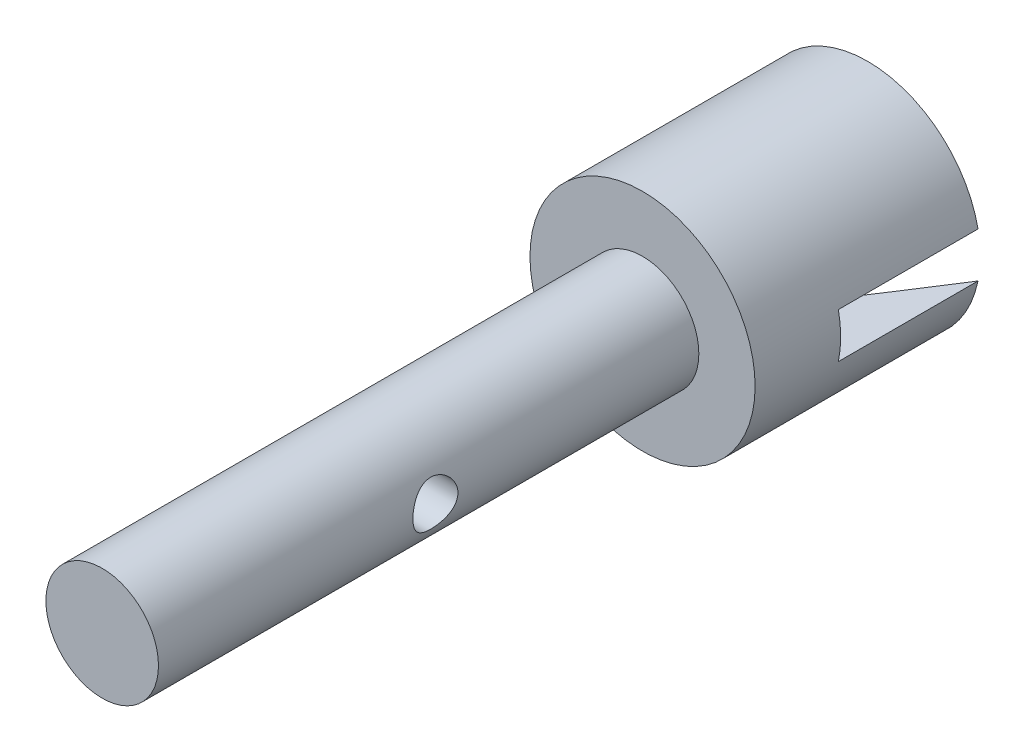
ISO-10303-21;
HEADER;
FILE_DESCRIPTION(('STEP AP214'),'2;1');
FILE_NAME('part.step','',(''),(''),'','','');
FILE_SCHEMA(('AUTOMOTIVE_DESIGN { 1 0 10303 214 1 1 1 1 }'));
ENDSEC;
DATA;
#1=APPLICATION_CONTEXT('core data for automotive mechanical design processes');
#2=APPLICATION_PROTOCOL_DEFINITION('international standard','automotive_design',2000,#1);
#3=PRODUCT_CONTEXT('',#1,'mechanical');
#4=PRODUCT('Part','Part','',(#3));
#5=PRODUCT_RELATED_PRODUCT_CATEGORY('part','',(#4));
#6=PRODUCT_DEFINITION_FORMATION('','',#4);
#7=PRODUCT_DEFINITION_CONTEXT('part definition',#1,'design');
#8=PRODUCT_DEFINITION('design','',#6,#7);
#9=PRODUCT_DEFINITION_SHAPE('','',#8);
#10=(LENGTH_UNIT() NAMED_UNIT(*) SI_UNIT(.MILLI.,.METRE.));
#11=(NAMED_UNIT(*) PLANE_ANGLE_UNIT() SI_UNIT($,.RADIAN.));
#12=(NAMED_UNIT(*) SI_UNIT($,.STERADIAN.) SOLID_ANGLE_UNIT());
#13=UNCERTAINTY_MEASURE_WITH_UNIT(LENGTH_MEASURE(1.E-05),#10,'distance_accuracy_value','');
#14=(GEOMETRIC_REPRESENTATION_CONTEXT(3) GLOBAL_UNCERTAINTY_ASSIGNED_CONTEXT((#13)) GLOBAL_UNIT_ASSIGNED_CONTEXT((#10,
#11,#12)) REPRESENTATION_CONTEXT('',''));
#15=CARTESIAN_POINT('',(0.,0.,0.));
#16=DIRECTION('',(0.,0.,1.));
#17=DIRECTION('',(1.,0.,0.));
#18=AXIS2_PLACEMENT_3D('',#15,#16,#17);
#19=CARTESIAN_POINT('',(0.,0.,10.));
#20=DIRECTION('',(0.,0.,-1.));
#21=DIRECTION('',(-1.,0.,0.));
#22=AXIS2_PLACEMENT_3D('',#19,#20,#21);
#23=CYLINDRICAL_SURFACE('',#22,5.);
#24=CARTESIAN_POINT('',(0.,0.,10.));
#25=DIRECTION('',(0.,0.,1.));
#26=DIRECTION('',(1.,0.,0.));
#27=AXIS2_PLACEMENT_3D('',#24,#25,#26);
#28=CIRCLE('',#27,5.);
#29=CARTESIAN_POINT('',(5.,0.,10.));
#30=VERTEX_POINT('',#29);
#31=EDGE_CURVE('E216',#30,#30,#28,.T.);
#32=ORIENTED_EDGE('',*,*,#31,.F.);
#33=EDGE_LOOP('',(#32));
#34=FACE_BOUND('',#33,.T.);
#35=DIRECTION('',(0.,0.,-1.));
#36=VECTOR('',#35,1.);
#37=CARTESIAN_POINT('',(-4.89897948556636,-1.,10.));
#38=LINE('',#37,#36);
#39=CARTESIAN_POINT('',(-4.89897948556636,-1.,0.));
#40=VERTEX_POINT('',#39);
#41=CARTESIAN_POINT('',(-4.89897948556636,-1.,6.2));
#42=VERTEX_POINT('',#41);
#43=EDGE_CURVE('E133',#40,#42,#38,.F.);
#44=ORIENTED_EDGE('',*,*,#43,.F.);
#45=CARTESIAN_POINT('',(0.,0.,0.));
#46=DIRECTION('',(0.,0.,1.));
#47=DIRECTION('',(1.,0.,0.));
#48=AXIS2_PLACEMENT_3D('',#45,#46,#47);
#49=CIRCLE('',#48,5.);
#50=CARTESIAN_POINT('',(4.89897948556636,-0.999999999999999,0.));
#51=VERTEX_POINT('',#50);
#52=EDGE_CURVE('E211',#40,#51,#49,.T.);
#53=ORIENTED_EDGE('',*,*,#52,.T.);
#54=DIRECTION('',(0.,0.,-1.));
#55=VECTOR('',#54,1.);
#56=CARTESIAN_POINT('',(4.89897948556636,-0.999999999999999,10.));
#57=LINE('',#56,#55);
#58=CARTESIAN_POINT('',(4.89897948556636,-0.999999999999999,6.2));
#59=VERTEX_POINT('',#58);
#60=EDGE_CURVE('E143',#59,#51,#57,.T.);
#61=ORIENTED_EDGE('',*,*,#60,.F.);
#62=CARTESIAN_POINT('',(0.,0.,6.2));
#63=DIRECTION('',(0.,0.,1.));
#64=DIRECTION('',(1.,0.,0.));
#65=AXIS2_PLACEMENT_3D('',#62,#63,#64);
#66=CIRCLE('',#65,5.);
#67=CARTESIAN_POINT('',(4.89897948556636,1.,6.2));
#68=VERTEX_POINT('',#67);
#69=EDGE_CURVE('E155',#59,#68,#66,.T.);
#70=ORIENTED_EDGE('',*,*,#69,.T.);
#71=DIRECTION('',(0.,0.,-1.));
#72=VECTOR('',#71,1.);
#73=CARTESIAN_POINT('',(4.89897948556636,1.,10.));
#74=LINE('',#73,#72);
#75=CARTESIAN_POINT('',(4.89897948556636,1.,0.));
#76=VERTEX_POINT('',#75);
#77=EDGE_CURVE('E319',#76,#68,#74,.F.);
#78=ORIENTED_EDGE('',*,*,#77,.F.);
#79=CARTESIAN_POINT('',(-4.89897948556636,0.999999999999999,0.));
#80=VERTEX_POINT('',#79);
#81=EDGE_CURVE('E219',#76,#80,#49,.T.);
#82=ORIENTED_EDGE('',*,*,#81,.T.);
#83=DIRECTION('',(0.,0.,-1.));
#84=VECTOR('',#83,1.);
#85=CARTESIAN_POINT('',(-4.89897948556636,0.999999999999999,10.));
#86=LINE('',#85,#84);
#87=CARTESIAN_POINT('',(-4.89897948556636,0.999999999999999,6.2));
#88=VERTEX_POINT('',#87);
#89=EDGE_CURVE('E153',#88,#80,#86,.T.);
#90=ORIENTED_EDGE('',*,*,#89,.F.);
#91=EDGE_CURVE('E147',#88,#42,#66,.T.);
#92=ORIENTED_EDGE('',*,*,#91,.T.);
#93=EDGE_LOOP('',(#44,#53,#61,#70,#78,#82,#90,#92));
#94=FACE_BOUND('',#93,.T.);
#95=ADVANCED_FACE('F42',(#34,#94),#23,.T.);
#96=CARTESIAN_POINT('',(0.,0.,0.));
#97=DIRECTION('',(0.,0.,1.));
#98=DIRECTION('',(1.,0.,0.));
#99=AXIS2_PLACEMENT_3D('',#96,#97,#98);
#100=PLANE('',#99);
#101=DIRECTION('',(1.,0.,0.));
#102=VECTOR('',#101,1.);
#103=CARTESIAN_POINT('',(6.07629143847177,-0.999999999999999,0.));
#104=LINE('',#103,#102);
#105=CARTESIAN_POINT('',(4.89855278994566,-0.999999999999999,0.));
#106=VERTEX_POINT('',#105);
#107=EDGE_CURVE('E257',#106,#51,#104,.T.);
#108=ORIENTED_EDGE('',*,*,#107,.T.);
#109=ORIENTED_EDGE('',*,*,#52,.F.);
#110=CARTESIAN_POINT('',(-4.89855278994566,-1.,0.));
#111=VERTEX_POINT('',#110);
#112=EDGE_CURVE('E138',#40,#111,#104,.T.);
#113=ORIENTED_EDGE('',*,*,#112,.T.);
#114=CARTESIAN_POINT('',(0.,0.,0.));
#115=DIRECTION('',(0.,0.,1.));
#116=DIRECTION('',(1.,0.,0.));
#117=AXIS2_PLACEMENT_3D('',#114,#115,#116);
#118=CIRCLE('',#117,4.99958192610986);
#119=EDGE_CURVE('E224',#111,#106,#118,.T.);
#120=ORIENTED_EDGE('',*,*,#119,.T.);
#121=EDGE_LOOP('',(#108,#109,#113,#120));
#122=FACE_BOUND('',#121,.T.);
#123=ADVANCED_FACE('F288',(#122),#100,.F.);
#124=DIRECTION('',(-1.,0.,0.));
#125=VECTOR('',#124,1.);
#126=CARTESIAN_POINT('',(6.07629143847177,1.,0.));
#127=LINE('',#126,#125);
#128=CARTESIAN_POINT('',(-4.89855278994566,0.999999999999999,0.));
#129=VERTEX_POINT('',#128);
#130=EDGE_CURVE('E162',#129,#80,#127,.T.);
#131=ORIENTED_EDGE('',*,*,#130,.T.);
#132=ORIENTED_EDGE('',*,*,#81,.F.);
#133=CARTESIAN_POINT('',(4.89855278994566,1.,0.));
#134=VERTEX_POINT('',#133);
#135=EDGE_CURVE('E255',#76,#134,#127,.T.);
#136=ORIENTED_EDGE('',*,*,#135,.T.);
#137=EDGE_CURVE('E225',#134,#129,#118,.T.);
#138=ORIENTED_EDGE('',*,*,#137,.T.);
#139=EDGE_LOOP('',(#131,#132,#136,#138));
#140=FACE_BOUND('',#139,.T.);
#141=ADVANCED_FACE('F253',(#140),#100,.F.);
#142=CARTESIAN_POINT('',(0.,0.,5.2));
#143=DIRECTION('',(0.,0.,-1.));
#144=DIRECTION('',(-1.,0.,0.));
#145=AXIS2_PLACEMENT_3D('',#142,#143,#144);
#146=CYLINDRICAL_SURFACE('',#145,3.);
#147=DIRECTION('',(0.,0.,-1.));
#148=VECTOR('',#147,1.);
#149=CARTESIAN_POINT('',(2.82842712474619,-0.999999999999999,5.2));
#150=LINE('',#149,#148);
#151=CARTESIAN_POINT('',(2.82842712474619,-0.999999999999999,3.20000000000003));
#152=VERTEX_POINT('',#151);
#153=CARTESIAN_POINT('',(2.82842712474619,-0.999999999999999,5.2));
#154=VERTEX_POINT('',#153);
#155=EDGE_CURVE('E199',#152,#154,#150,.F.);
#156=ORIENTED_EDGE('',*,*,#155,.F.);
#157=CARTESIAN_POINT('',(0.,0.,3.20000000000003));
#158=DIRECTION('',(0.,0.,1.));
#159=DIRECTION('',(1.,0.,0.));
#160=AXIS2_PLACEMENT_3D('',#157,#158,#159);
#161=CIRCLE('',#160,3.);
#162=CARTESIAN_POINT('',(-2.82842712474619,-1.,3.20000000000003));
#163=VERTEX_POINT('',#162);
#164=EDGE_CURVE('E221',#152,#163,#161,.F.);
#165=ORIENTED_EDGE('',*,*,#164,.T.);
#166=DIRECTION('',(0.,0.,-1.));
#167=VECTOR('',#166,1.);
#168=CARTESIAN_POINT('',(-2.82842712474619,-1.,5.2));
#169=LINE('',#168,#167);
#170=CARTESIAN_POINT('',(-2.82842712474619,-1.,5.2));
#171=VERTEX_POINT('',#170);
#172=EDGE_CURVE('E200',#171,#163,#169,.T.);
#173=ORIENTED_EDGE('',*,*,#172,.F.);
#174=CARTESIAN_POINT('',(0.,0.,5.2));
#175=DIRECTION('',(0.,0.,-1.));
#176=DIRECTION('',(-1.,0.,0.));
#177=AXIS2_PLACEMENT_3D('',#174,#175,#176);
#178=CIRCLE('',#177,3.);
#179=EDGE_CURVE('E205',#171,#154,#178,.F.);
#180=ORIENTED_EDGE('',*,*,#179,.T.);
#181=EDGE_LOOP('',(#156,#165,#173,#180));
#182=FACE_BOUND('',#181,.T.);
#183=ADVANCED_FACE('F307',(#182),#146,.F.);
#184=DIRECTION('',(0.,0.,-1.));
#185=VECTOR('',#184,1.);
#186=CARTESIAN_POINT('',(-2.82842712474619,0.999999999999999,5.2));
#187=LINE('',#186,#185);
#188=CARTESIAN_POINT('',(-2.82842712474619,0.999999999999999,3.20000000000003));
#189=VERTEX_POINT('',#188);
#190=CARTESIAN_POINT('',(-2.82842712474619,0.999999999999999,5.2));
#191=VERTEX_POINT('',#190);
#192=EDGE_CURVE('E172',#189,#191,#187,.F.);
#193=ORIENTED_EDGE('',*,*,#192,.F.);
#194=CARTESIAN_POINT('',(2.82842712474619,1.,3.20000000000003));
#195=VERTEX_POINT('',#194);
#196=EDGE_CURVE('E215',#189,#195,#161,.F.);
#197=ORIENTED_EDGE('',*,*,#196,.T.);
#198=DIRECTION('',(0.,0.,-1.));
#199=VECTOR('',#198,1.);
#200=CARTESIAN_POINT('',(2.82842712474619,1.,5.2));
#201=LINE('',#200,#199);
#202=CARTESIAN_POINT('',(2.82842712474619,1.,5.2));
#203=VERTEX_POINT('',#202);
#204=EDGE_CURVE('E154',#203,#195,#201,.T.);
#205=ORIENTED_EDGE('',*,*,#204,.F.);
#206=EDGE_CURVE('E204',#203,#191,#178,.F.);
#207=ORIENTED_EDGE('',*,*,#206,.T.);
#208=EDGE_LOOP('',(#193,#197,#205,#207));
#209=FACE_BOUND('',#208,.T.);
#210=ADVANCED_FACE('F241',(#209),#146,.F.);
#211=CARTESIAN_POINT('',(0.,0.,3.20000000000003));
#212=DIRECTION('',(0.,0.,-1.));
#213=DIRECTION('',(-1.,0.,0.));
#214=AXIS2_PLACEMENT_3D('',#211,#212,#213);
#215=CONICAL_SURFACE('',#214,3.,0.558505360638184);
#216=ORIENTED_EDGE('',*,*,#119,.F.);
#217=CARTESIAN_POINT('',(-8.87977638429061,-1.,-6.29943646068899));
#218=CARTESIAN_POINT('',(-8.62485468706497,-1.,-5.89404990245984));
#219=CARTESIAN_POINT('',(-8.36984370250016,-1.,-5.48871941443241));
#220=CARTESIAN_POINT('',(-7.85955995010029,-1.,-4.67821956304217));
#221=CARTESIAN_POINT('',(-7.60428718056262,-1.,-4.27305020075138));
#222=CARTESIAN_POINT('',(-7.09329845109507,-1.,-3.46276588968902));
#223=CARTESIAN_POINT('',(-6.83758235533659,-1.,-3.05765102655843));
#224=CARTESIAN_POINT('',(-6.32567649900563,-1.,-2.24772384830765));
#225=CARTESIAN_POINT('',(-6.06948674119116,-1.,-1.84291153144495));
#226=CARTESIAN_POINT('',(-5.54810381442262,-1.,-1.02060289298373));
#227=CARTESIAN_POINT('',(-5.28288805549352,-1.,-0.603120891314374));
#228=CARTESIAN_POINT('',(-4.75133764067995,-1.,0.231141641484121));
#229=CARTESIAN_POINT('',(-4.48500296516646,-1.,0.647922160126053));
#230=CARTESIAN_POINT('',(-4.08413396888195,-1.,1.27213078100434));
#231=CARTESIAN_POINT('',(-3.95030250343804,-1.,1.48001010607399));
#232=CARTESIAN_POINT('',(-3.6820036991485,-1.,1.89535783991245));
#233=CARTESIAN_POINT('',(-3.5475363614148,-1.,2.1028262493989));
#234=CARTESIAN_POINT('',(-3.27772835976446,-1.,2.51718609410812));
#235=CARTESIAN_POINT('',(-3.14238772169945,-1.,2.72407754615281));
#236=CARTESIAN_POINT('',(-2.8704503248386,-1.,3.13703242820196));
#237=CARTESIAN_POINT('',(-2.73385357883278,-1.,3.34309586660686));
#238=CARTESIAN_POINT('',(-2.53640538654589,-1.,3.63795799358787));
#239=CARTESIAN_POINT('',(-2.47633148188561,-1.,3.72727692314117));
#240=CARTESIAN_POINT('',(-2.35572846997511,-1.,3.90560745302455));
#241=CARTESIAN_POINT('',(-2.29519935889419,-1.,3.99461905075912));
#242=CARTESIAN_POINT('',(-2.11273908308545,-1.,4.26116426394567));
#243=CARTESIAN_POINT('',(-1.98998198218578,-1.,4.43813777756844));
#244=CARTESIAN_POINT('',(-1.80354983218315,-1.,4.70107055658159));
#245=CARTESIAN_POINT('',(-1.74124172485339,-1.,4.78799820888622));
#246=CARTESIAN_POINT('',(-1.61542419473619,-1.,4.96097828028616));
#247=CARTESIAN_POINT('',(-1.55191481637994,-1.,5.04703073157204));
#248=CARTESIAN_POINT('',(-1.42329508925699,-1.,5.21785550333635));
#249=CARTESIAN_POINT('',(-1.35818569023595,-1.,5.30262853721451));
#250=CARTESIAN_POINT('',(-1.22566531716715,-1.,5.4703517396183));
#251=CARTESIAN_POINT('',(-1.15825479682112,-1.,5.55330226223947));
#252=CARTESIAN_POINT('',(-1.05891469317619,-1.,5.67039215772902));
#253=CARTESIAN_POINT('',(-1.0283808870388,-1.,5.70571450018287));
#254=CARTESIAN_POINT('',(-0.966501784885243,-1.,5.77565018170993));
#255=CARTESIAN_POINT('',(-0.935156406422144,-1.,5.81026344810384));
#256=CARTESIAN_POINT('',(-0.871248299450225,-1.,5.8788205167953));
#257=CARTESIAN_POINT('',(-0.83867841208312,-1.,5.91275767575923));
#258=CARTESIAN_POINT('',(-0.77229945319324,-1.,5.97939547543334));
#259=CARTESIAN_POINT('',(-0.738490567761414,-1.,6.01209630034758));
#260=CARTESIAN_POINT('',(-0.668677371051238,-1.,6.07640696581772));
#261=CARTESIAN_POINT('',(-0.632644115602017,-1.,6.10798567391845));
#262=CARTESIAN_POINT('',(-0.558487506731788,-1.,6.16871407846804));
#263=CARTESIAN_POINT('',(-0.520361812693335,-1.,6.19786095890631));
#264=CARTESIAN_POINT('',(-0.441962478736427,-1.,6.25224421653255));
#265=CARTESIAN_POINT('',(-0.401715629154389,-1.,6.27751847807885));
#266=CARTESIAN_POINT('',(-0.318362244070148,-1.,6.32269086208983));
#267=CARTESIAN_POINT('',(-0.275265108152848,-1.,6.34260565557928));
#268=CARTESIAN_POINT('',(-0.193963017607086,-1.,6.37184725568524));
#269=CARTESIAN_POINT('',(-0.156218463093718,-1.,6.38241588793346));
#270=CARTESIAN_POINT('',(-0.079468706426041,-1.,6.39677484350348));
#271=CARTESIAN_POINT('',(-0.0404658063634323,-1.,6.40057690142516));
#272=CARTESIAN_POINT('',(0.0376673883506787,-1.,6.4007580855741));
#273=CARTESIAN_POINT('',(0.0767977378829279,-1.,6.39711672780417));
#274=CARTESIAN_POINT('',(0.153815863717374,-1.,6.38301415880219));
#275=CARTESIAN_POINT('',(0.19170122866461,-1.,6.37254044799102));
#276=CARTESIAN_POINT('',(0.282495231227714,-1.,6.34017332231968));
#277=CARTESIAN_POINT('',(0.334298261784892,-1.,6.31524310156205));
#278=CARTESIAN_POINT('',(0.408830505451774,-1.,6.27249305462904));
#279=CARTESIAN_POINT('',(0.433197863487603,-1.,6.2573097399619));
#280=CARTESIAN_POINT('',(0.480981478904471,-1.,6.22551709775036));
#281=CARTESIAN_POINT('',(0.504398093020739,-1.,6.20890831248854));
#282=CARTESIAN_POINT('',(0.576202743440409,-1.,6.15531462825456));
#283=CARTESIAN_POINT('',(0.623125075981879,-1.,6.11637922815102));
#284=CARTESIAN_POINT('',(0.714193442037966,-1.,6.03536114320501));
#285=CARTESIAN_POINT('',(0.758336140813116,-1.,5.99327480579525));
#286=CARTESIAN_POINT('',(0.844669944358028,-1.,5.9068690778355));
#287=CARTESIAN_POINT('',(0.8868537696441,-1.,5.86254246604463));
#288=CARTESIAN_POINT('',(0.969626711432247,-1.,5.7724218986141));
#289=CARTESIAN_POINT('',(1.01021554006159,-1.,5.72662768077701));
#290=CARTESIAN_POINT('',(1.09053927048582,-1.,5.6335345767348));
#291=CARTESIAN_POINT('',(1.13026230152136,-1.,5.58622549210189));
#292=CARTESIAN_POINT('',(1.20872325492745,-1.,5.49079190249018));
#293=CARTESIAN_POINT('',(1.24746107187564,-1.,5.44266731115892));
#294=CARTESIAN_POINT('',(1.32405380390927,-1.,5.34591055006495));
#295=CARTESIAN_POINT('',(1.36191062129793,-1.,5.29727988255062));
#296=CARTESIAN_POINT('',(1.43698203162339,-1.,5.19952997162763));
#297=CARTESIAN_POINT('',(1.47419665412237,-1.,5.15041075087352));
#298=CARTESIAN_POINT('',(1.58352654290772,-1.,5.0045076550753));
#299=CARTESIAN_POINT('',(1.65490064604826,-1.,4.90716863225926));
#300=CARTESIAN_POINT('',(1.79623213496297,-1.,4.71146589189941));
#301=CARTESIAN_POINT('',(1.86618945306397,-1.,4.61310212574667));
#302=CARTESIAN_POINT('',(2.07453894079934,-1.,4.31689774386698));
#303=CARTESIAN_POINT('',(2.21138746398098,-1.,4.11797286095337));
#304=CARTESIAN_POINT('',(2.48286425142145,-1.,3.71825005829645));
#305=CARTESIAN_POINT('',(2.61748941766817,-1.,3.51745005011907));
#306=CARTESIAN_POINT('',(2.88517315703923,-1.,3.11483483241971));
#307=CARTESIAN_POINT('',(3.01823186706282,-1.,2.91301971384599));
#308=CARTESIAN_POINT('',(3.28210760514407,-1.,2.51051266844726));
#309=CARTESIAN_POINT('',(3.41293403571522,-1.,2.30982689361473));
#310=CARTESIAN_POINT('',(3.67384848385047,-1.,1.90796981730113));
#311=CARTESIAN_POINT('',(3.80393648480235,-0.999999999999999,1.70679850504103));
#312=CARTESIAN_POINT('',(4.19325857501525,-0.999999999999999,1.10296969707002));
#313=CARTESIAN_POINT('',(4.45168489819596,-0.999999999999999,0.699791698047211));
#314=CARTESIAN_POINT('',(5.05781609898769,-0.999999999999999,-0.249073395092955));
#315=CARTESIAN_POINT('',(5.4050060200441,-0.999999999999999,-0.795088891537357));
#316=CARTESIAN_POINT('',(6.09818340306552,-0.999999999999999,-1.88802549630387));
#317=CARTESIAN_POINT('',(6.44417062723601,-0.999999999999999,-2.43494675529943));
#318=CARTESIAN_POINT('',(7.13876334915836,-0.999999999999999,-3.53465974566125));
#319=CARTESIAN_POINT('',(7.48736115184786,-0.999999999999999,-4.08745633498996));
#320=CARTESIAN_POINT('',(8.1839464707224,-0.999999999999999,-5.19328379623946));
#321=CARTESIAN_POINT('',(8.53193409240768,-0.999999999999999,-5.7463146016921));
#322=CARTESIAN_POINT('',(8.87977638429061,-0.999999999999999,-6.29943646068899));
#323=B_SPLINE_CURVE_WITH_KNOTS('',3,(#217,#218,#219,#220,#221,#222,#223,#224,#225,#226,#227,
#228,#229,#230,#231,#232,#233,#234,#235,#236,#237,#238,#239,#240,#241,#242,#243,#244,#245,#246,
#247,#248,#249,#250,#251,#252,#253,#254,#255,#256,#257,#258,#259,#260,#261,#262,#263,#264,#265,
#266,#267,#268,#269,#270,#271,#272,#273,#274,#275,#276,#277,#278,#279,#280,#281,#282,#283,#284,
#285,#286,#287,#288,#289,#290,#291,#292,#293,#294,#295,#296,#297,#298,#299,#300,#301,#302,#303,
#304,#305,#306,#307,#308,#309,#310,#311,#312,#313,#314,#315,#316,#317,#318,#319,#320,#321,#322),
.UNSPECIFIED.,.F.,.F.,(4,2,2,2,2,2,2,2,2,2,2,2,2,2,2,2,2,2,2,2,2,2,2,2,2,2,2,2,2,2,2,2,2,2,2,2,
2,2,2,2,2,2,2,2,2,2,2,2,2,2,2,2,4),(0.,1.43663156480434,2.87327253320332,4.3104845370769,
5.74768819856201,7.23149180704074,8.71532155533592,9.45702291943218,10.1987229870205,
10.9404011984536,11.6820718662636,12.0049956390114,12.3279221323049,12.9740293674278,
13.2948784263177,13.6157156411395,13.9363668051933,14.2569551089729,14.3970165198444,
14.5370922156993,14.678179913113,14.8192465060573,14.9629079342879,15.1067334753039,
15.2490472120351,15.390913015926,15.507998552317,15.6248808402659,15.7420852168406,
15.8595046188357,16.0309355795445,16.1170452801423,16.2031223665625,16.3857930454704,
16.5686788563895,16.7521973314562,16.9357487781076,17.1210547130318,17.3063803938072,
17.4912595720346,17.6761302168866,18.0382172742677,18.4003215862498,19.1246374727777,
19.8498894571951,20.5750775810888,21.2937640220039,22.0124665674154,23.4491351113839,
25.3902823579336,27.3317937553911,29.2923903615286,31.2526056850822),.UNSPECIFIED.);
#324=EDGE_CURVE('E191',#111,#163,#323,.T.);
#325=ORIENTED_EDGE('',*,*,#324,.T.);
#326=ORIENTED_EDGE('',*,*,#164,.F.);
#327=EDGE_CURVE('E144',#152,#106,#323,.T.);
#328=ORIENTED_EDGE('',*,*,#327,.T.);
#329=EDGE_LOOP('',(#216,#325,#326,#328));
#330=FACE_BOUND('',#329,.T.);
#331=ADVANCED_FACE('F44',(#330),#215,.F.);
#332=ORIENTED_EDGE('',*,*,#137,.F.);
#333=CARTESIAN_POINT('',(8.87977638429061,1.,-6.29943646068899));
#334=CARTESIAN_POINT('',(8.62485468706497,1.,-5.89404990245984));
#335=CARTESIAN_POINT('',(8.36984370250016,1.,-5.48871941443241));
#336=CARTESIAN_POINT('',(7.85955995010029,1.,-4.67821956304217));
#337=CARTESIAN_POINT('',(7.60428718056262,1.,-4.27305020075138));
#338=CARTESIAN_POINT('',(7.09329845109507,1.,-3.46276588968902));
#339=CARTESIAN_POINT('',(6.83758235533659,1.,-3.05765102655843));
#340=CARTESIAN_POINT('',(6.32567649900563,1.,-2.24772384830765));
#341=CARTESIAN_POINT('',(6.06948674119116,1.,-1.84291153144495));
#342=CARTESIAN_POINT('',(5.54810381442262,1.,-1.02060289298373));
#343=CARTESIAN_POINT('',(5.28288805549352,1.,-0.603120891314374));
#344=CARTESIAN_POINT('',(4.75133764067995,1.,0.231141641484121));
#345=CARTESIAN_POINT('',(4.48500296516646,1.,0.647922160126053));
#346=CARTESIAN_POINT('',(4.08413396888195,1.,1.27213078100434));
#347=CARTESIAN_POINT('',(3.95030250343804,1.,1.48001010607399));
#348=CARTESIAN_POINT('',(3.6820036991485,1.,1.89535783991245));
#349=CARTESIAN_POINT('',(3.5475363614148,1.,2.1028262493989));
#350=CARTESIAN_POINT('',(3.27772835976446,1.,2.51718609410812));
#351=CARTESIAN_POINT('',(3.14238772169945,1.,2.72407754615281));
#352=CARTESIAN_POINT('',(2.8704503248386,1.,3.13703242820196));
#353=CARTESIAN_POINT('',(2.73385357883278,1.,3.34309586660686));
#354=CARTESIAN_POINT('',(2.53640538654589,1.,3.63795799358787));
#355=CARTESIAN_POINT('',(2.47633148188561,1.,3.72727692314117));
#356=CARTESIAN_POINT('',(2.35572846997511,1.,3.90560745302455));
#357=CARTESIAN_POINT('',(2.29519935889419,1.,3.99461905075912));
#358=CARTESIAN_POINT('',(2.11273908308545,1.,4.26116426394567));
#359=CARTESIAN_POINT('',(1.98998198218578,1.,4.43813777756844));
#360=CARTESIAN_POINT('',(1.80354983218315,1.,4.70107055658159));
#361=CARTESIAN_POINT('',(1.74124172485339,1.,4.78799820888622));
#362=CARTESIAN_POINT('',(1.61542419473619,1.,4.96097828028616));
#363=CARTESIAN_POINT('',(1.55191481637994,1.,5.04703073157204));
#364=CARTESIAN_POINT('',(1.42329508925699,1.,5.21785550333635));
#365=CARTESIAN_POINT('',(1.35818569023595,1.,5.30262853721451));
#366=CARTESIAN_POINT('',(1.22566531716715,1.,5.4703517396183));
#367=CARTESIAN_POINT('',(1.15825479682112,1.,5.55330226223947));
#368=CARTESIAN_POINT('',(1.05891469317619,1.,5.67039215772902));
#369=CARTESIAN_POINT('',(1.0283808870388,1.,5.70571450018287));
#370=CARTESIAN_POINT('',(0.966501784885243,1.,5.77565018170993));
#371=CARTESIAN_POINT('',(0.935156406422144,1.,5.81026344810384));
#372=CARTESIAN_POINT('',(0.871248299450225,1.,5.8788205167953));
#373=CARTESIAN_POINT('',(0.83867841208312,1.,5.91275767575923));
#374=CARTESIAN_POINT('',(0.77229945319324,1.,5.97939547543334));
#375=CARTESIAN_POINT('',(0.738490567761414,1.,6.01209630034758));
#376=CARTESIAN_POINT('',(0.668677371051238,1.,6.07640696581772));
#377=CARTESIAN_POINT('',(0.632644115602017,1.,6.10798567391845));
#378=CARTESIAN_POINT('',(0.558487506731788,1.,6.16871407846804));
#379=CARTESIAN_POINT('',(0.520361812693335,1.,6.19786095890631));
#380=CARTESIAN_POINT('',(0.441962478736427,1.,6.25224421653255));
#381=CARTESIAN_POINT('',(0.401715629154389,1.,6.27751847807885));
#382=CARTESIAN_POINT('',(0.318362244070148,1.,6.32269086208983));
#383=CARTESIAN_POINT('',(0.275265108152848,1.,6.34260565557928));
#384=CARTESIAN_POINT('',(0.193963017607086,1.,6.37184725568524));
#385=CARTESIAN_POINT('',(0.156218463093718,1.,6.38241588793346));
#386=CARTESIAN_POINT('',(0.079468706426041,1.,6.39677484350348));
#387=CARTESIAN_POINT('',(0.0404658063634323,1.,6.40057690142516));
#388=CARTESIAN_POINT('',(-0.0376673883506787,1.,6.4007580855741));
#389=CARTESIAN_POINT('',(-0.0767977378829279,1.,6.39711672780417));
#390=CARTESIAN_POINT('',(-0.153815863717374,1.,6.38301415880219));
#391=CARTESIAN_POINT('',(-0.19170122866461,1.,6.37254044799102));
#392=CARTESIAN_POINT('',(-0.282495231227714,1.,6.34017332231968));
#393=CARTESIAN_POINT('',(-0.334298261784892,1.,6.31524310156205));
#394=CARTESIAN_POINT('',(-0.408830505451774,1.,6.27249305462904));
#395=CARTESIAN_POINT('',(-0.433197863487603,1.,6.2573097399619));
#396=CARTESIAN_POINT('',(-0.480981478904471,1.,6.22551709775036));
#397=CARTESIAN_POINT('',(-0.504398093020739,1.,6.20890831248854));
#398=CARTESIAN_POINT('',(-0.576202743440409,1.,6.15531462825456));
#399=CARTESIAN_POINT('',(-0.623125075981879,1.,6.11637922815102));
#400=CARTESIAN_POINT('',(-0.714193442037966,1.,6.03536114320501));
#401=CARTESIAN_POINT('',(-0.758336140813116,1.,5.99327480579525));
#402=CARTESIAN_POINT('',(-0.844669944358028,1.,5.9068690778355));
#403=CARTESIAN_POINT('',(-0.8868537696441,1.,5.86254246604463));
#404=CARTESIAN_POINT('',(-0.969626711432247,1.,5.7724218986141));
#405=CARTESIAN_POINT('',(-1.01021554006159,1.,5.72662768077701));
#406=CARTESIAN_POINT('',(-1.09053927048582,1.,5.6335345767348));
#407=CARTESIAN_POINT('',(-1.13026230152136,1.,5.58622549210189));
#408=CARTESIAN_POINT('',(-1.20872325492745,1.,5.49079190249018));
#409=CARTESIAN_POINT('',(-1.24746107187564,1.,5.44266731115892));
#410=CARTESIAN_POINT('',(-1.32405380390927,1.,5.34591055006495));
#411=CARTESIAN_POINT('',(-1.36191062129793,1.,5.29727988255062));
#412=CARTESIAN_POINT('',(-1.43698203162339,1.,5.19952997162763));
#413=CARTESIAN_POINT('',(-1.47419665412237,1.,5.15041075087352));
#414=CARTESIAN_POINT('',(-1.58352654290772,1.,5.0045076550753));
#415=CARTESIAN_POINT('',(-1.65490064604826,1.,4.90716863225926));
#416=CARTESIAN_POINT('',(-1.79623213496297,1.,4.71146589189941));
#417=CARTESIAN_POINT('',(-1.86618945306397,1.,4.61310212574667));
#418=CARTESIAN_POINT('',(-2.07453894079934,1.,4.31689774386698));
#419=CARTESIAN_POINT('',(-2.21138746398098,1.,4.11797286095337));
#420=CARTESIAN_POINT('',(-2.48286425142145,1.,3.71825005829645));
#421=CARTESIAN_POINT('',(-2.61748941766817,1.,3.51745005011907));
#422=CARTESIAN_POINT('',(-2.88517315703923,1.,3.11483483241971));
#423=CARTESIAN_POINT('',(-3.01823186706282,1.,2.91301971384599));
#424=CARTESIAN_POINT('',(-3.28210760514407,1.,2.51051266844726));
#425=CARTESIAN_POINT('',(-3.41293403571522,1.,2.30982689361473));
#426=CARTESIAN_POINT('',(-3.67384848385047,1.,1.90796981730113));
#427=CARTESIAN_POINT('',(-3.80393648480235,0.999999999999999,1.70679850504103));
#428=CARTESIAN_POINT('',(-4.19325857501525,0.999999999999999,1.10296969707002));
#429=CARTESIAN_POINT('',(-4.45168489819596,0.999999999999999,0.699791698047211));
#430=CARTESIAN_POINT('',(-5.05781609898769,0.999999999999999,-0.249073395092955));
#431=CARTESIAN_POINT('',(-5.4050060200441,0.999999999999999,-0.795088891537357));
#432=CARTESIAN_POINT('',(-6.09818340306552,0.999999999999999,-1.88802549630387));
#433=CARTESIAN_POINT('',(-6.44417062723601,0.999999999999999,-2.43494675529943));
#434=CARTESIAN_POINT('',(-7.13876334915836,0.999999999999999,-3.53465974566125));
#435=CARTESIAN_POINT('',(-7.48736115184786,0.999999999999999,-4.08745633498996));
#436=CARTESIAN_POINT('',(-8.1839464707224,0.999999999999999,-5.19328379623946));
#437=CARTESIAN_POINT('',(-8.53193409240768,0.999999999999999,-5.7463146016921));
#438=CARTESIAN_POINT('',(-8.87977638429061,0.999999999999999,-6.29943646068899));
#439=B_SPLINE_CURVE_WITH_KNOTS('',3,(#333,#334,#335,#336,#337,#338,#339,#340,#341,#342,#343,
#344,#345,#346,#347,#348,#349,#350,#351,#352,#353,#354,#355,#356,#357,#358,#359,#360,#361,#362,
#363,#364,#365,#366,#367,#368,#369,#370,#371,#372,#373,#374,#375,#376,#377,#378,#379,#380,#381,
#382,#383,#384,#385,#386,#387,#388,#389,#390,#391,#392,#393,#394,#395,#396,#397,#398,#399,#400,
#401,#402,#403,#404,#405,#406,#407,#408,#409,#410,#411,#412,#413,#414,#415,#416,#417,#418,#419,
#420,#421,#422,#423,#424,#425,#426,#427,#428,#429,#430,#431,#432,#433,#434,#435,#436,#437,#438),
.UNSPECIFIED.,.F.,.F.,(4,2,2,2,2,2,2,2,2,2,2,2,2,2,2,2,2,2,2,2,2,2,2,2,2,2,2,2,2,2,2,2,2,2,2,2,
2,2,2,2,2,2,2,2,2,2,2,2,2,2,2,2,4),(0.,1.43663156480434,2.87327253320332,4.3104845370769,
5.74768819856201,7.23149180704074,8.71532155533592,9.45702291943218,10.1987229870205,
10.9404011984536,11.6820718662636,12.0049956390114,12.3279221323049,12.9740293674278,
13.2948784263177,13.6157156411395,13.9363668051933,14.2569551089729,14.3970165198444,
14.5370922156993,14.678179913113,14.8192465060573,14.9629079342879,15.1067334753039,
15.2490472120351,15.390913015926,15.507998552317,15.6248808402659,15.7420852168406,
15.8595046188357,16.0309355795445,16.1170452801423,16.2031223665625,16.3857930454704,
16.5686788563895,16.7521973314562,16.9357487781076,17.1210547130318,17.3063803938072,
17.4912595720346,17.6761302168866,18.0382172742677,18.4003215862498,19.1246374727777,
19.8498894571951,20.5750775810888,21.2937640220039,22.0124665674154,23.4491351113839,
25.3902823579336,27.3317937553911,29.2923903615286,31.2526056850822),.UNSPECIFIED.);
#440=EDGE_CURVE('E157',#134,#195,#439,.T.);
#441=ORIENTED_EDGE('',*,*,#440,.T.);
#442=ORIENTED_EDGE('',*,*,#196,.F.);
#443=EDGE_CURVE('E173',#189,#129,#439,.T.);
#444=ORIENTED_EDGE('',*,*,#443,.T.);
#445=EDGE_LOOP('',(#332,#441,#442,#444));
#446=FACE_BOUND('',#445,.T.);
#447=ADVANCED_FACE('F249',(#446),#215,.F.);
#448=CARTESIAN_POINT('',(0.,0.,5.2));
#449=DIRECTION('',(-1.,0.,0.));
#450=DIRECTION('',(0.,-1.,0.));
#451=AXIS2_PLACEMENT_3D('',#448,#449,#450);
#452=SPHERICAL_SURFACE('',#451,3.);
#453=ORIENTED_EDGE('',*,*,#179,.F.);
#454=CARTESIAN_POINT('',(0.,-1.,5.2));
#455=DIRECTION('',(0.,1.,0.));
#456=DIRECTION('',(-1.,0.,0.));
#457=AXIS2_PLACEMENT_3D('',#454,#455,#456);
#458=CIRCLE('',#457,2.82842712474619);
#459=CARTESIAN_POINT('',(-2.64575131106459,-1.,6.2));
#460=VERTEX_POINT('',#459);
#461=EDGE_CURVE('E11',#171,#460,#458,.T.);
#462=ORIENTED_EDGE('',*,*,#461,.T.);
#463=CARTESIAN_POINT('',(0.,0.,6.2));
#464=DIRECTION('',(0.,0.,1.));
#465=DIRECTION('',(1.,0.,0.));
#466=AXIS2_PLACEMENT_3D('',#463,#464,#465);
#467=CIRCLE('',#466,2.82842712474619);
#468=CARTESIAN_POINT('',(-2.64575131106459,1.,6.2));
#469=VERTEX_POINT('',#468);
#470=EDGE_CURVE('E149',#469,#460,#467,.T.);
#471=ORIENTED_EDGE('',*,*,#470,.F.);
#472=CARTESIAN_POINT('',(0.,1.,5.2));
#473=DIRECTION('',(0.,-1.,0.));
#474=DIRECTION('',(1.,0.,0.));
#475=AXIS2_PLACEMENT_3D('',#472,#473,#474);
#476=CIRCLE('',#475,2.82842712474619);
#477=EDGE_CURVE('E52',#469,#191,#476,.T.);
#478=ORIENTED_EDGE('',*,*,#477,.T.);
#479=ORIENTED_EDGE('',*,*,#206,.F.);
#480=CARTESIAN_POINT('',(2.64575131106459,1.,6.2));
#481=VERTEX_POINT('',#480);
#482=EDGE_CURVE('E229',#203,#481,#476,.T.);
#483=ORIENTED_EDGE('',*,*,#482,.T.);
#484=CARTESIAN_POINT('',(2.64575131106459,-1.,6.2));
#485=VERTEX_POINT('',#484);
#486=EDGE_CURVE('E228',#485,#481,#467,.T.);
#487=ORIENTED_EDGE('',*,*,#486,.F.);
#488=EDGE_CURVE('E47',#485,#154,#458,.T.);
#489=ORIENTED_EDGE('',*,*,#488,.T.);
#490=EDGE_LOOP('',(#453,#462,#471,#478,#479,#483,#487,#489));
#491=FACE_BOUND('',#490,.T.);
#492=ADVANCED_FACE('F188',(#491),#452,.F.);
#493=CARTESIAN_POINT('',(0.,0.,10.));
#494=DIRECTION('',(0.,0.,1.));
#495=DIRECTION('',(1.,0.,0.));
#496=AXIS2_PLACEMENT_3D('',#493,#494,#495);
#497=PLANE('',#496);
#498=CARTESIAN_POINT('',(0.,0.,10.));
#499=DIRECTION('',(0.,0.,1.));
#500=DIRECTION('',(1.,0.,0.));
#501=AXIS2_PLACEMENT_3D('',#498,#499,#500);
#502=CIRCLE('',#501,2.5);
#503=CARTESIAN_POINT('',(2.5,0.,10.));
#504=VERTEX_POINT('',#503);
#505=EDGE_CURVE('E212',#504,#504,#502,.T.);
#506=ORIENTED_EDGE('',*,*,#505,.F.);
#507=EDGE_LOOP('',(#506));
#508=FACE_BOUND('',#507,.T.);
#509=ORIENTED_EDGE('',*,*,#31,.T.);
#510=EDGE_LOOP('',(#509));
#511=FACE_BOUND('',#510,.T.);
#512=ADVANCED_FACE('F296',(#508,#511),#497,.T.);
#513=CARTESIAN_POINT('',(0.,0.,34.));
#514=DIRECTION('',(0.,0.,-1.));
#515=DIRECTION('',(-1.,0.,0.));
#516=AXIS2_PLACEMENT_3D('',#513,#514,#515);
#517=CYLINDRICAL_SURFACE('',#516,2.5);
#518=CARTESIAN_POINT('',(-2.5,0.,20.7));
#519=CARTESIAN_POINT('',(-2.49999635613542,-0.053746502721446,20.7000049259119));
#520=CARTESIAN_POINT('',(-2.49824647153466,-0.107586282045337,20.7043588760442));
#521=CARTESIAN_POINT('',(-2.49141726550321,-0.213748240208949,20.7216238517606));
#522=CARTESIAN_POINT('',(-2.48632889349439,-0.266065888780625,20.7345581395431));
#523=CARTESIAN_POINT('',(-2.47337104606559,-0.367476961363702,20.7684380390294));
#524=CARTESIAN_POINT('',(-2.46551068182036,-0.416580330808479,20.7893574231084));
#525=CARTESIAN_POINT('',(-2.44778305398039,-0.510535985164184,20.8385095866633));
#526=CARTESIAN_POINT('',(-2.43791648729028,-0.555389738375497,20.8667398274595));
#527=CARTESIAN_POINT('',(-2.41665443085209,-0.641750503785198,20.9311177492805));
#528=CARTESIAN_POINT('',(-2.40521148464595,-0.683031136275107,20.9675533281201));
#529=CARTESIAN_POINT('',(-2.38230288453097,-0.759087502392361,21.0467000017384));
#530=CARTESIAN_POINT('',(-2.37083722226896,-0.793860053566767,21.0894141486059));
#531=CARTESIAN_POINT('',(-2.34861395898568,-0.85743728364644,21.1822140351211));
#532=CARTESIAN_POINT('',(-2.33791057982476,-0.885907490597737,21.2325432430116));
#533=CARTESIAN_POINT('',(-2.31916823593396,-0.933877359518575,21.33776819921));
#534=CARTESIAN_POINT('',(-2.31112800622088,-0.953381282142918,21.3926617639242));
#535=CARTESIAN_POINT('',(-2.29913178830409,-0.981949411697935,21.5028561667961));
#536=CARTESIAN_POINT('',(-2.29500710177802,-0.991446982902825,21.5580256177881));
#537=CARTESIAN_POINT('',(-2.29082002024572,-1.00108648082002,21.6693174991536));
#538=CARTESIAN_POINT('',(-2.29075562761384,-1.00123300815661,21.7254394473125));
#539=CARTESIAN_POINT('',(-2.29455250139997,-0.992494683752273,21.832878335729));
#540=CARTESIAN_POINT('',(-2.29814087519225,-0.98423765715257,21.8842578572045));
#541=CARTESIAN_POINT('',(-2.30838093803918,-0.959973440148911,21.9848297780034));
#542=CARTESIAN_POINT('',(-2.31503316160836,-0.943964897402317,22.0340217940552));
#543=CARTESIAN_POINT('',(-2.33079742544265,-0.904347366275538,22.130008918098));
#544=CARTESIAN_POINT('',(-2.33995689640394,-0.880589931157659,22.1767346195273));
#545=CARTESIAN_POINT('',(-2.35969058194945,-0.826253230366108,22.2657079081808));
#546=CARTESIAN_POINT('',(-2.37026532728424,-0.795671402550423,22.3079538047014));
#547=CARTESIAN_POINT('',(-2.39263368371135,-0.725775299727219,22.390204864401));
#548=CARTESIAN_POINT('',(-2.40445832488076,-0.685968731485319,22.429784364723));
#549=CARTESIAN_POINT('',(-2.42729912479141,-0.600157213715098,22.501842239001));
#550=CARTESIAN_POINT('',(-2.43831512222662,-0.554151032667218,22.5343191987052));
#551=CARTESIAN_POINT('',(-2.45857340632274,-0.456038826302923,22.5918087237079));
#552=CARTESIAN_POINT('',(-2.46777635047707,-0.40383024567324,22.6166611405985));
#553=CARTESIAN_POINT('',(-2.48307414164379,-0.295511882741442,22.657083930539));
#554=CARTESIAN_POINT('',(-2.48917056731191,-0.239404098424838,22.6726590187787));
#555=CARTESIAN_POINT('',(-2.49728069753455,-0.128447943803911,22.6932241477099));
#556=CARTESIAN_POINT('',(-2.49951472916757,-0.0737216469927681,22.6987862271268));
#557=CARTESIAN_POINT('',(-2.50034239255315,0.035922654903908,22.7008565502643));
#558=CARTESIAN_POINT('',(-2.49893696791146,0.0908406066119613,22.6973671407738));
#559=CARTESIAN_POINT('',(-2.49278783531877,0.196716369560994,22.681854123724));
#560=CARTESIAN_POINT('',(-2.48819695672762,0.247741245887737,22.6702210098245));
#561=CARTESIAN_POINT('',(-2.4762972070275,0.34706771403039,22.6392821458451));
#562=CARTESIAN_POINT('',(-2.46898798678265,0.395368955112422,22.6199754101657));
#563=CARTESIAN_POINT('',(-2.45208297385406,0.489539392908351,22.57360753016));
#564=CARTESIAN_POINT('',(-2.44242407989902,0.535289011377703,22.5463272639784));
#565=CARTESIAN_POINT('',(-2.42186682372762,0.621721795623278,22.4850298380472));
#566=CARTESIAN_POINT('',(-2.41096796555135,0.662402920380563,22.4510099785387));
#567=CARTESIAN_POINT('',(-2.38822558819056,0.74036152151441,22.3745649935252));
#568=CARTESIAN_POINT('',(-2.37636720712526,0.777236966903033,22.3317332292469));
#569=CARTESIAN_POINT('',(-2.35370836458566,0.843375598706857,22.2402799584953));
#570=CARTESIAN_POINT('',(-2.34290807763255,0.872637530668756,22.19165749983));
#571=CARTESIAN_POINT('',(-2.32357149953854,0.922903750965814,22.089269152703));
#572=CARTESIAN_POINT('',(-2.31505815442394,0.943825297267227,22.0354580003939));
#573=CARTESIAN_POINT('',(-2.30161836738966,0.976148109852653,21.9246331741424));
#574=CARTESIAN_POINT('',(-2.29668927847999,0.987556402634659,21.8676218970938));
#575=CARTESIAN_POINT('',(-2.29135879649963,0.999857808639202,21.7564360491127));
#576=CARTESIAN_POINT('',(-2.29065710504086,1.00144854115144,21.7023525802033));
#577=CARTESIAN_POINT('',(-2.29307418016549,0.995901579638764,21.5947275711434));
#578=CARTESIAN_POINT('',(-2.29619246162397,0.988764993956893,21.5411859630487));
#579=CARTESIAN_POINT('',(-2.3056332453951,0.966535683076826,21.4383339050725));
#580=CARTESIAN_POINT('',(-2.31182415913725,0.95176874678549,21.3889398627835));
#581=CARTESIAN_POINT('',(-2.32662000616348,0.915002724245508,21.2933106851933));
#582=CARTESIAN_POINT('',(-2.33522560603003,0.893001640696907,21.2470764265501));
#583=CARTESIAN_POINT('',(-2.35449304802246,0.840936381379866,21.1561951903646));
#584=CARTESIAN_POINT('',(-2.36524441156621,0.810482667579746,21.1117906649348));
#585=CARTESIAN_POINT('',(-2.38731902186119,0.74294605963575,21.0285033413981));
#586=CARTESIAN_POINT('',(-2.39864244024203,0.705861167409063,20.9896222139358));
#587=CARTESIAN_POINT('',(-2.42146783543697,0.623252753136233,20.9158985733682));
#588=CARTESIAN_POINT('',(-2.43293378981093,0.57733800057307,20.881481346551));
#589=CARTESIAN_POINT('',(-2.45400203356858,0.479950160142889,20.8208314786892));
#590=CARTESIAN_POINT('',(-2.46360345546453,0.428474502273618,20.7946026439237));
#591=CARTESIAN_POINT('',(-2.47969857407931,0.3223690312476,20.7516888924049));
#592=CARTESIAN_POINT('',(-2.48624681527514,0.267815809109847,20.7348353382198));
#593=CARTESIAN_POINT('',(-2.49572153104683,0.156438273140611,20.7106804395229));
#594=CARTESIAN_POINT('',(-2.49865949747819,0.0996217629294573,20.7033487816281));
#595=CARTESIAN_POINT('',(-2.49987949752068,0.0284561489454657,20.7003023095109));
#596=CARTESIAN_POINT('',(-2.50000096484588,0.0142313443703796,20.6999986956854));
#597=CARTESIAN_POINT('',(-2.5,0.,20.7));
#598=B_SPLINE_CURVE_WITH_KNOTS('',3,(#518,#519,#520,#521,#522,#523,#524,#525,#526,#527,#528,
#529,#530,#531,#532,#533,#534,#535,#536,#537,#538,#539,#540,#541,#542,#543,#544,#545,#546,#547,
#548,#549,#550,#551,#552,#553,#554,#555,#556,#557,#558,#559,#560,#561,#562,#563,#564,#565,#566,
#567,#568,#569,#570,#571,#572,#573,#574,#575,#576,#577,#578,#579,#580,#581,#582,#583,#584,#585,
#586,#587,#588,#589,#590,#591,#592,#593,#594,#595,#596,#597),.UNSPECIFIED.,.T.,.F.,(4,2,2,2,2,2,
2,2,2,2,2,2,2,2,2,2,2,2,2,2,2,2,2,2,2,2,2,2,2,2,2,2,2,2,2,2,2,2,2,4),(0.,0.161201493946536,
0.322841818003967,0.48395572873579,0.645013767839921,0.812986908501987,0.981041974672057,
1.15657629409608,1.33202711559134,1.49952052654415,1.66693153170244,1.82269164200686,
1.97847893628024,2.13744563149408,2.29647210969092,2.46779174593279,2.63914546419867,
2.81388456581404,2.98853478056895,3.15284592264004,3.31711446785041,3.47400227782183,
3.63091024496899,3.79261756699132,3.95438979749485,4.12684237312208,4.29932334521875,
4.47347522570414,4.64749836322967,4.80899836696375,4.97047786281524,5.12557159274385,
5.28070817902582,5.44472734028347,5.60879600674197,5.78350211766919,5.95828931820268,
6.1298215050666,6.30080626202172,6.34349022948399),.UNSPECIFIED.);
#599=CARTESIAN_POINT('',(-2.5,0.,20.7));
#600=VERTEX_POINT('',#599);
#601=EDGE_CURVE('E262',#600,#600,#598,.T.);
#602=ORIENTED_EDGE('',*,*,#601,.F.);
#603=EDGE_LOOP('',(#602));
#604=FACE_BOUND('',#603,.T.);
#605=CARTESIAN_POINT('',(2.5,0.,20.7));
#606=CARTESIAN_POINT('',(2.49999635613542,0.053746502721446,20.7000049259119));
#607=CARTESIAN_POINT('',(2.49824647153466,0.107586282045337,20.7043588760442));
#608=CARTESIAN_POINT('',(2.49141726550321,0.213748240208948,20.7216238517606));
#609=CARTESIAN_POINT('',(2.48632889349439,0.266065888780625,20.7345581395431));
#610=CARTESIAN_POINT('',(2.47337104606559,0.367476961363702,20.7684380390294));
#611=CARTESIAN_POINT('',(2.46551068182036,0.416580330808479,20.7893574231084));
#612=CARTESIAN_POINT('',(2.44778305398039,0.510535985164184,20.8385095866633));
#613=CARTESIAN_POINT('',(2.43791648729028,0.555389738375497,20.8667398274595));
#614=CARTESIAN_POINT('',(2.41665443085209,0.641750503785198,20.9311177492805));
#615=CARTESIAN_POINT('',(2.40521148464595,0.683031136275107,20.9675533281201));
#616=CARTESIAN_POINT('',(2.38230288453097,0.759087502392361,21.0467000017384));
#617=CARTESIAN_POINT('',(2.37083722226896,0.793860053566767,21.0894141486059));
#618=CARTESIAN_POINT('',(2.34861395898568,0.85743728364644,21.1822140351211));
#619=CARTESIAN_POINT('',(2.33791057982476,0.885907490597737,21.2325432430116));
#620=CARTESIAN_POINT('',(2.31916823593396,0.933877359518575,21.33776819921));
#621=CARTESIAN_POINT('',(2.31112800622088,0.953381282142918,21.3926617639242));
#622=CARTESIAN_POINT('',(2.29913178830409,0.981949411697935,21.5028561667961));
#623=CARTESIAN_POINT('',(2.29500710177802,0.991446982902825,21.5580256177881));
#624=CARTESIAN_POINT('',(2.29082002024572,1.00108648082002,21.6693174991536));
#625=CARTESIAN_POINT('',(2.29075562761384,1.00123300815661,21.7254394473125));
#626=CARTESIAN_POINT('',(2.29455250139997,0.992494683752273,21.832878335729));
#627=CARTESIAN_POINT('',(2.29814087519225,0.98423765715257,21.8842578572045));
#628=CARTESIAN_POINT('',(2.30838093803918,0.959973440148911,21.9848297780034));
#629=CARTESIAN_POINT('',(2.31503316160836,0.943964897402317,22.0340217940552));
#630=CARTESIAN_POINT('',(2.33079742544265,0.904347366275538,22.130008918098));
#631=CARTESIAN_POINT('',(2.33995689640394,0.880589931157659,22.1767346195273));
#632=CARTESIAN_POINT('',(2.35969058194945,0.826253230366108,22.2657079081808));
#633=CARTESIAN_POINT('',(2.37026532728424,0.795671402550423,22.3079538047014));
#634=CARTESIAN_POINT('',(2.39263368371135,0.725775299727219,22.390204864401));
#635=CARTESIAN_POINT('',(2.40445832488076,0.685968731485319,22.429784364723));
#636=CARTESIAN_POINT('',(2.42729912479141,0.600157213715098,22.501842239001));
#637=CARTESIAN_POINT('',(2.43831512222662,0.554151032667218,22.5343191987052));
#638=CARTESIAN_POINT('',(2.45857340632274,0.456038826302923,22.5918087237079));
#639=CARTESIAN_POINT('',(2.46777635047707,0.40383024567324,22.6166611405985));
#640=CARTESIAN_POINT('',(2.48307414164379,0.295511882741442,22.657083930539));
#641=CARTESIAN_POINT('',(2.48917056731191,0.239404098424838,22.6726590187787));
#642=CARTESIAN_POINT('',(2.49728069753455,0.128447943803911,22.6932241477099));
#643=CARTESIAN_POINT('',(2.49951472916757,0.0737216469927681,22.6987862271268));
#644=CARTESIAN_POINT('',(2.50034239255315,-0.035922654903908,22.7008565502643));
#645=CARTESIAN_POINT('',(2.49893696791146,-0.0908406066119613,22.6973671407738));
#646=CARTESIAN_POINT('',(2.49278783531877,-0.196716369560994,22.681854123724));
#647=CARTESIAN_POINT('',(2.48819695672762,-0.247741245887737,22.6702210098245));
#648=CARTESIAN_POINT('',(2.4762972070275,-0.34706771403039,22.6392821458451));
#649=CARTESIAN_POINT('',(2.46898798678265,-0.395368955112422,22.6199754101657));
#650=CARTESIAN_POINT('',(2.45208297385406,-0.489539392908351,22.57360753016));
#651=CARTESIAN_POINT('',(2.44242407989902,-0.535289011377703,22.5463272639784));
#652=CARTESIAN_POINT('',(2.42186682372762,-0.621721795623278,22.4850298380472));
#653=CARTESIAN_POINT('',(2.41096796555135,-0.662402920380563,22.4510099785387));
#654=CARTESIAN_POINT('',(2.38822558819056,-0.74036152151441,22.3745649935252));
#655=CARTESIAN_POINT('',(2.37636720712526,-0.777236966903033,22.3317332292469));
#656=CARTESIAN_POINT('',(2.35370836458566,-0.843375598706857,22.2402799584953));
#657=CARTESIAN_POINT('',(2.34290807763255,-0.872637530668756,22.19165749983));
#658=CARTESIAN_POINT('',(2.32357149953854,-0.922903750965814,22.089269152703));
#659=CARTESIAN_POINT('',(2.31505815442394,-0.943825297267227,22.0354580003939));
#660=CARTESIAN_POINT('',(2.30161836738966,-0.976148109852653,21.9246331741424));
#661=CARTESIAN_POINT('',(2.29668927847999,-0.987556402634659,21.8676218970938));
#662=CARTESIAN_POINT('',(2.29135879649963,-0.999857808639202,21.7564360491127));
#663=CARTESIAN_POINT('',(2.29065710504086,-1.00144854115144,21.7023525802033));
#664=CARTESIAN_POINT('',(2.29307418016549,-0.995901579638764,21.5947275711434));
#665=CARTESIAN_POINT('',(2.29619246162397,-0.988764993956893,21.5411859630487));
#666=CARTESIAN_POINT('',(2.3056332453951,-0.966535683076826,21.4383339050725));
#667=CARTESIAN_POINT('',(2.31182415913725,-0.95176874678549,21.3889398627835));
#668=CARTESIAN_POINT('',(2.32662000616348,-0.915002724245508,21.2933106851933));
#669=CARTESIAN_POINT('',(2.33522560603003,-0.893001640696907,21.2470764265501));
#670=CARTESIAN_POINT('',(2.35449304802246,-0.840936381379866,21.1561951903646));
#671=CARTESIAN_POINT('',(2.36524441156621,-0.810482667579746,21.1117906649348));
#672=CARTESIAN_POINT('',(2.38731902186119,-0.74294605963575,21.0285033413981));
#673=CARTESIAN_POINT('',(2.39864244024203,-0.705861167409063,20.9896222139358));
#674=CARTESIAN_POINT('',(2.42146783543697,-0.623252753136233,20.9158985733682));
#675=CARTESIAN_POINT('',(2.43293378981093,-0.57733800057307,20.881481346551));
#676=CARTESIAN_POINT('',(2.45400203356858,-0.479950160142889,20.8208314786892));
#677=CARTESIAN_POINT('',(2.46360345546453,-0.428474502273617,20.7946026439237));
#678=CARTESIAN_POINT('',(2.47969857407931,-0.3223690312476,20.7516888924049));
#679=CARTESIAN_POINT('',(2.48624681527514,-0.267815809109847,20.7348353382198));
#680=CARTESIAN_POINT('',(2.49572153104683,-0.156438273140611,20.7106804395229));
#681=CARTESIAN_POINT('',(2.49865949747819,-0.0996217629294573,20.7033487816281));
#682=CARTESIAN_POINT('',(2.49987949752068,-0.0284561489454657,20.7003023095109));
#683=CARTESIAN_POINT('',(2.50000096484588,-0.0142313443703796,20.6999986956854));
#684=CARTESIAN_POINT('',(2.5,0.,20.7));
#685=B_SPLINE_CURVE_WITH_KNOTS('',3,(#605,#606,#607,#608,#609,#610,#611,#612,#613,#614,#615,
#616,#617,#618,#619,#620,#621,#622,#623,#624,#625,#626,#627,#628,#629,#630,#631,#632,#633,#634,
#635,#636,#637,#638,#639,#640,#641,#642,#643,#644,#645,#646,#647,#648,#649,#650,#651,#652,#653,
#654,#655,#656,#657,#658,#659,#660,#661,#662,#663,#664,#665,#666,#667,#668,#669,#670,#671,#672,
#673,#674,#675,#676,#677,#678,#679,#680,#681,#682,#683,#684),.UNSPECIFIED.,.T.,.F.,(4,2,2,2,2,2,
2,2,2,2,2,2,2,2,2,2,2,2,2,2,2,2,2,2,2,2,2,2,2,2,2,2,2,2,2,2,2,2,2,4),(0.,0.161201493946536,
0.322841818003967,0.48395572873579,0.645013767839921,0.812986908501987,0.981041974672057,
1.15657629409608,1.33202711559134,1.49952052654415,1.66693153170244,1.82269164200686,
1.97847893628024,2.13744563149408,2.29647210969092,2.46779174593279,2.63914546419867,
2.81388456581404,2.98853478056895,3.15284592264004,3.31711446785041,3.47400227782183,
3.63091024496899,3.79261756699132,3.95438979749485,4.12684237312208,4.29932334521875,
4.47347522570414,4.64749836322967,4.80899836696375,4.97047786281524,5.12557159274385,
5.28070817902582,5.44472734028347,5.60879600674197,5.78350211766919,5.95828931820268,
6.1298215050666,6.30080626202172,6.34349022948399),.UNSPECIFIED.);
#686=CARTESIAN_POINT('',(2.5,0.,20.7));
#687=VERTEX_POINT('',#686);
#688=EDGE_CURVE('E271',#687,#687,#685,.T.);
#689=ORIENTED_EDGE('',*,*,#688,.F.);
#690=EDGE_LOOP('',(#689));
#691=FACE_BOUND('',#690,.T.);
#692=CARTESIAN_POINT('',(0.,0.,34.));
#693=DIRECTION('',(0.,0.,1.));
#694=DIRECTION('',(1.,0.,0.));
#695=AXIS2_PLACEMENT_3D('',#692,#693,#694);
#696=CIRCLE('',#695,2.5);
#697=CARTESIAN_POINT('',(2.5,0.,34.));
#698=VERTEX_POINT('',#697);
#699=EDGE_CURVE('E208',#698,#698,#696,.T.);
#700=ORIENTED_EDGE('',*,*,#699,.F.);
#701=EDGE_LOOP('',(#700));
#702=FACE_BOUND('',#701,.T.);
#703=ORIENTED_EDGE('',*,*,#505,.T.);
#704=EDGE_LOOP('',(#703));
#705=FACE_BOUND('',#704,.T.);
#706=ADVANCED_FACE('F299',(#604,#691,#702,#705),#517,.T.);
#707=CARTESIAN_POINT('',(0.,0.,34.));
#708=DIRECTION('',(0.,0.,1.));
#709=DIRECTION('',(1.,0.,0.));
#710=AXIS2_PLACEMENT_3D('',#707,#708,#709);
#711=PLANE('',#710);
#712=ORIENTED_EDGE('',*,*,#699,.T.);
#713=EDGE_LOOP('',(#712));
#714=FACE_BOUND('',#713,.T.);
#715=ADVANCED_FACE('F303',(#714),#711,.T.);
#716=CARTESIAN_POINT('',(0.,0.,6.2));
#717=DIRECTION('',(0.,0.,1.));
#718=DIRECTION('',(1.,0.,0.));
#719=AXIS2_PLACEMENT_3D('',#716,#717,#718);
#720=PLANE('',#719);
#721=DIRECTION('',(1.,0.,0.));
#722=VECTOR('',#721,1.);
#723=CARTESIAN_POINT('',(6.07629143847177,-0.999999999999999,6.2));
#724=LINE('',#723,#722);
#725=EDGE_CURVE('E67',#485,#59,#724,.T.);
#726=ORIENTED_EDGE('',*,*,#725,.F.);
#727=ORIENTED_EDGE('',*,*,#486,.T.);
#728=DIRECTION('',(-1.,0.,0.));
#729=VECTOR('',#728,1.);
#730=CARTESIAN_POINT('',(6.07629143847177,1.,6.2));
#731=LINE('',#730,#729);
#732=EDGE_CURVE('E160',#68,#481,#731,.T.);
#733=ORIENTED_EDGE('',*,*,#732,.F.);
#734=ORIENTED_EDGE('',*,*,#69,.F.);
#735=EDGE_LOOP('',(#726,#727,#733,#734));
#736=FACE_BOUND('',#735,.T.);
#737=ADVANCED_FACE('F285',(#736),#720,.F.);
#738=CARTESIAN_POINT('',(6.07629143847177,1.,6.2));
#739=DIRECTION('',(0.,-1.,0.));
#740=DIRECTION('',(1.,0.,0.));
#741=AXIS2_PLACEMENT_3D('',#738,#739,#740);
#742=PLANE('',#741);
#743=ORIENTED_EDGE('',*,*,#77,.T.);
#744=ORIENTED_EDGE('',*,*,#732,.T.);
#745=ORIENTED_EDGE('',*,*,#482,.F.);
#746=ORIENTED_EDGE('',*,*,#204,.T.);
#747=ORIENTED_EDGE('',*,*,#440,.F.);
#748=ORIENTED_EDGE('',*,*,#135,.F.);
#749=EDGE_LOOP('',(#743,#744,#745,#746,#747,#748));
#750=FACE_BOUND('',#749,.T.);
#751=ADVANCED_FACE('F181',(#750),#742,.T.);
#752=CARTESIAN_POINT('',(6.07629143847177,-0.999999999999999,6.2));
#753=DIRECTION('',(0.,1.,0.));
#754=DIRECTION('',(-1.,0.,0.));
#755=AXIS2_PLACEMENT_3D('',#752,#753,#754);
#756=PLANE('',#755);
#757=ORIENTED_EDGE('',*,*,#60,.T.);
#758=ORIENTED_EDGE('',*,*,#107,.F.);
#759=ORIENTED_EDGE('',*,*,#327,.F.);
#760=ORIENTED_EDGE('',*,*,#155,.T.);
#761=ORIENTED_EDGE('',*,*,#488,.F.);
#762=ORIENTED_EDGE('',*,*,#725,.T.);
#763=EDGE_LOOP('',(#757,#758,#759,#760,#761,#762));
#764=FACE_BOUND('',#763,.T.);
#765=ADVANCED_FACE('F183',(#764),#756,.T.);
#766=ORIENTED_EDGE('',*,*,#43,.T.);
#767=EDGE_CURVE('E136',#42,#460,#724,.T.);
#768=ORIENTED_EDGE('',*,*,#767,.T.);
#769=ORIENTED_EDGE('',*,*,#461,.F.);
#770=ORIENTED_EDGE('',*,*,#172,.T.);
#771=ORIENTED_EDGE('',*,*,#324,.F.);
#772=ORIENTED_EDGE('',*,*,#112,.F.);
#773=EDGE_LOOP('',(#766,#768,#769,#770,#771,#772));
#774=FACE_BOUND('',#773,.T.);
#775=ADVANCED_FACE('F135',(#774),#756,.T.);
#776=ORIENTED_EDGE('',*,*,#89,.T.);
#777=ORIENTED_EDGE('',*,*,#130,.F.);
#778=ORIENTED_EDGE('',*,*,#443,.F.);
#779=ORIENTED_EDGE('',*,*,#192,.T.);
#780=ORIENTED_EDGE('',*,*,#477,.F.);
#781=EDGE_CURVE('E59',#469,#88,#731,.T.);
#782=ORIENTED_EDGE('',*,*,#781,.T.);
#783=EDGE_LOOP('',(#776,#777,#778,#779,#780,#782));
#784=FACE_BOUND('',#783,.T.);
#785=ADVANCED_FACE('F175',(#784),#742,.T.);
#786=ORIENTED_EDGE('',*,*,#781,.F.);
#787=ORIENTED_EDGE('',*,*,#470,.T.);
#788=ORIENTED_EDGE('',*,*,#767,.F.);
#789=ORIENTED_EDGE('',*,*,#91,.F.);
#790=EDGE_LOOP('',(#786,#787,#788,#789));
#791=FACE_BOUND('',#790,.T.);
#792=ADVANCED_FACE('F146',(#791),#720,.F.);
#793=CARTESIAN_POINT('',(-5.001,0.,21.7));
#794=DIRECTION('',(1.,0.,0.));
#795=DIRECTION('',(0.,0.,-1.));
#796=AXIS2_PLACEMENT_3D('',#793,#794,#795);
#797=CYLINDRICAL_SURFACE('',#796,1.);
#798=ORIENTED_EDGE('',*,*,#601,.T.);
#799=EDGE_LOOP('',(#798));
#800=FACE_BOUND('',#799,.T.);
#801=ORIENTED_EDGE('',*,*,#688,.T.);
#802=EDGE_LOOP('',(#801));
#803=FACE_BOUND('',#802,.T.);
#804=ADVANCED_FACE('F275',(#800,#803),#797,.F.);
#805=CLOSED_SHELL('',(#95,#123,#141,#183,#210,#331,#447,#492,#512,#706,#715,#737,#751,#765,#775,
#785,#792,#804));
#806=MANIFOLD_SOLID_BREP('B2',#805);
#807=ADVANCED_BREP_SHAPE_REPRESENTATION('',(#18,#806),#14);
#808=SHAPE_DEFINITION_REPRESENTATION(#9,#807);
ENDSEC;
END-ISO-10303-21;
